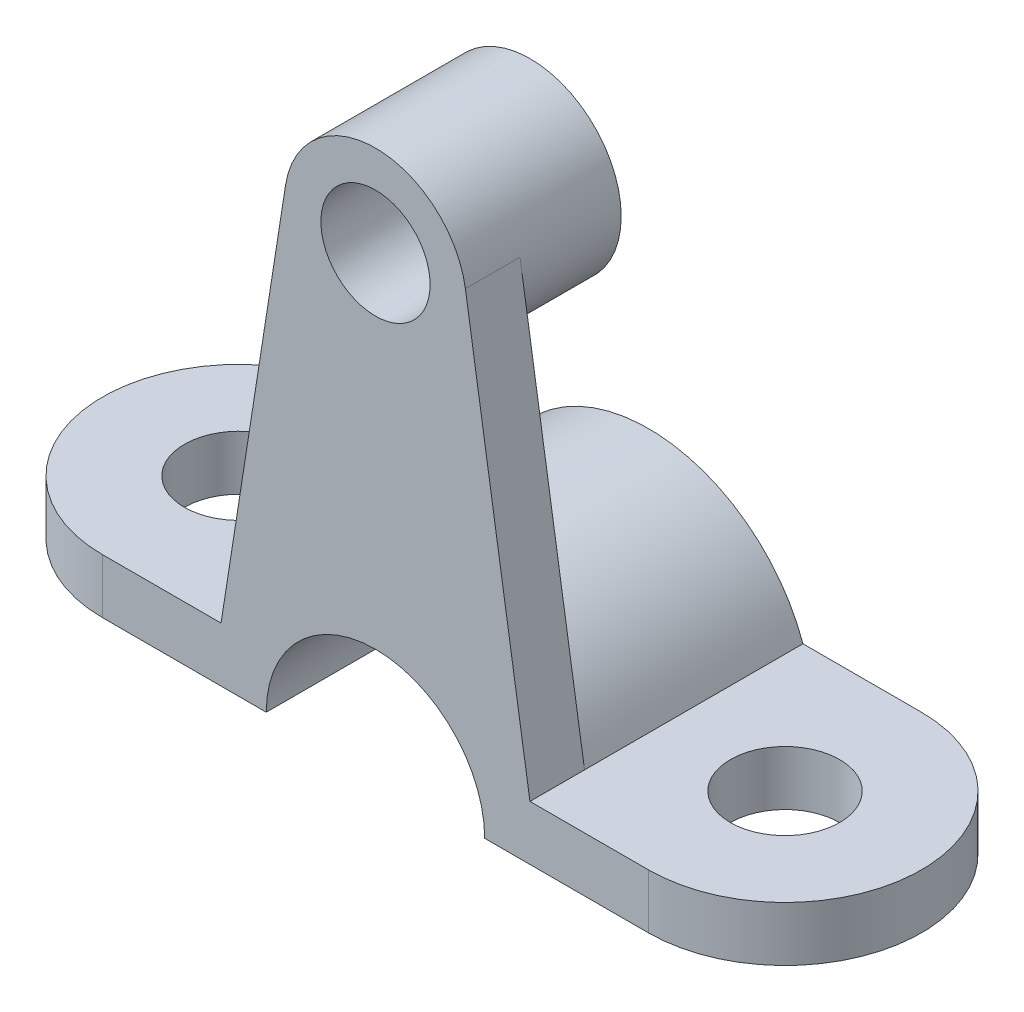
ISO-10303-21;
HEADER;
FILE_DESCRIPTION(('STEP AP214'),'2;1');
FILE_NAME('part.step','',(''),(''),'','','');
FILE_SCHEMA(('AUTOMOTIVE_DESIGN { 1 0 10303 214 1 1 1 1 }'));
ENDSEC;
DATA;
#1=APPLICATION_CONTEXT('core data for automotive mechanical design processes');
#2=APPLICATION_PROTOCOL_DEFINITION('international standard','automotive_design',2000,#1);
#3=PRODUCT_CONTEXT('',#1,'mechanical');
#4=PRODUCT('Part','Part','',(#3));
#5=PRODUCT_RELATED_PRODUCT_CATEGORY('part','',(#4));
#6=PRODUCT_DEFINITION_FORMATION('','',#4);
#7=PRODUCT_DEFINITION_CONTEXT('part definition',#1,'design');
#8=PRODUCT_DEFINITION('design','',#6,#7);
#9=PRODUCT_DEFINITION_SHAPE('','',#8);
#10=(LENGTH_UNIT() NAMED_UNIT(*) SI_UNIT(.MILLI.,.METRE.));
#11=(NAMED_UNIT(*) PLANE_ANGLE_UNIT() SI_UNIT($,.RADIAN.));
#12=(NAMED_UNIT(*) SI_UNIT($,.STERADIAN.) SOLID_ANGLE_UNIT());
#13=UNCERTAINTY_MEASURE_WITH_UNIT(LENGTH_MEASURE(1.E-05),#10,'distance_accuracy_value','');
#14=(GEOMETRIC_REPRESENTATION_CONTEXT(3) GLOBAL_UNCERTAINTY_ASSIGNED_CONTEXT((#13)) GLOBAL_UNIT_ASSIGNED_CONTEXT((#10,
#11,#12)) REPRESENTATION_CONTEXT('',''));
#15=CARTESIAN_POINT('',(0.,0.,0.));
#16=DIRECTION('',(0.,0.,1.));
#17=DIRECTION('',(1.,0.,0.));
#18=AXIS2_PLACEMENT_3D('',#15,#16,#17);
#19=CARTESIAN_POINT('',(0.,0.,30.));
#20=DIRECTION('',(0.,0.,-1.));
#21=DIRECTION('',(-1.,0.,0.));
#22=AXIS2_PLACEMENT_3D('',#19,#20,#21);
#23=CYLINDRICAL_SURFACE('',#22,36.);
#24=CARTESIAN_POINT('',(0.,0.,18.));
#25=DIRECTION('',(0.,0.,1.));
#26=DIRECTION('',(1.,0.,0.));
#27=AXIS2_PLACEMENT_3D('',#24,#25,#26);
#28=CIRCLE('',#27,36.);
#29=CARTESIAN_POINT('',(33.9411254969543,12.,18.));
#30=VERTEX_POINT('',#29);
#31=CARTESIAN_POINT('',(-33.9411254969543,12.,18.));
#32=VERTEX_POINT('',#31);
#33=EDGE_CURVE('E47',#30,#32,#28,.T.);
#34=ORIENTED_EDGE('',*,*,#33,.F.);
#35=DIRECTION('',(0.,0.,-1.));
#36=VECTOR('',#35,1.);
#37=CARTESIAN_POINT('',(33.9411254969543,12.,30.));
#38=LINE('',#37,#36);
#39=CARTESIAN_POINT('',(33.9411254969543,12.,-30.));
#40=VERTEX_POINT('',#39);
#41=EDGE_CURVE('E185',#40,#30,#38,.F.);
#42=ORIENTED_EDGE('',*,*,#41,.F.);
#43=CARTESIAN_POINT('',(0.,0.,-30.));
#44=DIRECTION('',(0.,0.,1.));
#45=DIRECTION('',(1.,0.,0.));
#46=AXIS2_PLACEMENT_3D('',#43,#44,#45);
#47=CIRCLE('',#46,36.);
#48=CARTESIAN_POINT('',(-33.9411254969543,12.,-30.));
#49=VERTEX_POINT('',#48);
#50=EDGE_CURVE('E187',#40,#49,#47,.T.);
#51=ORIENTED_EDGE('',*,*,#50,.T.);
#52=DIRECTION('',(0.,0.,-1.));
#53=VECTOR('',#52,1.);
#54=CARTESIAN_POINT('',(-33.9411254969543,12.,30.));
#55=LINE('',#54,#53);
#56=EDGE_CURVE('E167',#49,#32,#55,.F.);
#57=ORIENTED_EDGE('',*,*,#56,.T.);
#58=EDGE_LOOP('',(#34,#42,#51,#57));
#59=FACE_BOUND('',#58,.T.);
#60=ADVANCED_FACE('F33',(#59),#23,.T.);
#61=CARTESIAN_POINT('',(-36.,0.,30.));
#62=DIRECTION('',(0.,1.,0.));
#63=DIRECTION('',(0.,0.,1.));
#64=AXIS2_PLACEMENT_3D('',#61,#62,#63);
#65=PLANE('',#64);
#66=CARTESIAN_POINT('',(-60.,0.,0.));
#67=DIRECTION('',(0.,1.,0.));
#68=DIRECTION('',(0.,0.,1.));
#69=AXIS2_PLACEMENT_3D('',#66,#67,#68);
#70=CIRCLE('',#69,12.);
#71=CARTESIAN_POINT('',(-60.,0.,12.));
#72=VERTEX_POINT('',#71);
#73=EDGE_CURVE('E291',#72,#72,#70,.T.);
#74=ORIENTED_EDGE('',*,*,#73,.T.);
#75=EDGE_LOOP('',(#74));
#76=FACE_BOUND('',#75,.T.);
#77=DIRECTION('',(1.,0.,0.));
#78=VECTOR('',#77,1.);
#79=CARTESIAN_POINT('',(-36.,0.,-30.));
#80=LINE('',#79,#78);
#81=CARTESIAN_POINT('',(-60.,0.,-30.));
#82=VERTEX_POINT('',#81);
#83=CARTESIAN_POINT('',(-24.,0.,-30.));
#84=VERTEX_POINT('',#83);
#85=EDGE_CURVE('E197',#82,#84,#80,.T.);
#86=ORIENTED_EDGE('',*,*,#85,.T.);
#87=DIRECTION('',(0.,0.,-1.));
#88=VECTOR('',#87,1.);
#89=CARTESIAN_POINT('',(-24.,0.,30.));
#90=LINE('',#89,#88);
#91=CARTESIAN_POINT('',(-24.,0.,30.));
#92=VERTEX_POINT('',#91);
#93=EDGE_CURVE('E11',#92,#84,#90,.T.);
#94=ORIENTED_EDGE('',*,*,#93,.F.);
#95=DIRECTION('',(1.,0.,0.));
#96=VECTOR('',#95,1.);
#97=CARTESIAN_POINT('',(-36.,0.,30.));
#98=LINE('',#97,#96);
#99=CARTESIAN_POINT('',(-60.,0.,30.));
#100=VERTEX_POINT('',#99);
#101=EDGE_CURVE('E188',#100,#92,#98,.T.);
#102=ORIENTED_EDGE('',*,*,#101,.F.);
#103=CARTESIAN_POINT('',(-60.,0.,0.));
#104=DIRECTION('',(0.,1.,0.));
#105=DIRECTION('',(0.,0.,1.));
#106=AXIS2_PLACEMENT_3D('',#103,#104,#105);
#107=CIRCLE('',#106,30.);
#108=EDGE_CURVE('E144',#82,#100,#107,.T.);
#109=ORIENTED_EDGE('',*,*,#108,.F.);
#110=EDGE_LOOP('',(#86,#94,#102,#109));
#111=FACE_BOUND('',#110,.T.);
#112=ADVANCED_FACE('F221',(#76,#111),#65,.F.);
#113=CARTESIAN_POINT('',(0.,0.,30.));
#114=DIRECTION('',(0.,0.,-1.));
#115=DIRECTION('',(-1.,0.,0.));
#116=AXIS2_PLACEMENT_3D('',#113,#114,#115);
#117=CYLINDRICAL_SURFACE('',#116,24.);
#118=CARTESIAN_POINT('',(0.,0.,-30.));
#119=DIRECTION('',(0.,0.,-1.));
#120=DIRECTION('',(1.,0.,0.));
#121=AXIS2_PLACEMENT_3D('',#118,#119,#120);
#122=CIRCLE('',#121,24.);
#123=CARTESIAN_POINT('',(24.,0.,-30.));
#124=VERTEX_POINT('',#123);
#125=EDGE_CURVE('E199',#84,#124,#122,.T.);
#126=ORIENTED_EDGE('',*,*,#125,.T.);
#127=DIRECTION('',(0.,0.,-1.));
#128=VECTOR('',#127,1.);
#129=CARTESIAN_POINT('',(24.,0.,30.));
#130=LINE('',#129,#128);
#131=CARTESIAN_POINT('',(24.,0.,30.));
#132=VERTEX_POINT('',#131);
#133=EDGE_CURVE('E40',#132,#124,#130,.T.);
#134=ORIENTED_EDGE('',*,*,#133,.F.);
#135=CARTESIAN_POINT('',(0.,0.,30.));
#136=DIRECTION('',(0.,0.,-1.));
#137=DIRECTION('',(1.,0.,0.));
#138=AXIS2_PLACEMENT_3D('',#135,#136,#137);
#139=CIRCLE('',#138,24.);
#140=EDGE_CURVE('E190',#92,#132,#139,.T.);
#141=ORIENTED_EDGE('',*,*,#140,.F.);
#142=ORIENTED_EDGE('',*,*,#93,.T.);
#143=EDGE_LOOP('',(#126,#134,#141,#142));
#144=FACE_BOUND('',#143,.T.);
#145=ADVANCED_FACE('F219',(#144),#117,.F.);
#146=CARTESIAN_POINT('',(24.,0.,30.));
#147=DIRECTION('',(0.,1.,0.));
#148=DIRECTION('',(0.,0.,1.));
#149=AXIS2_PLACEMENT_3D('',#146,#147,#148);
#150=PLANE('',#149);
#151=CARTESIAN_POINT('',(60.,0.,0.));
#152=DIRECTION('',(0.,-1.,0.));
#153=DIRECTION('',(0.,0.,1.));
#154=AXIS2_PLACEMENT_3D('',#151,#152,#153);
#155=CIRCLE('',#154,12.);
#156=CARTESIAN_POINT('',(60.,0.,12.));
#157=VERTEX_POINT('',#156);
#158=EDGE_CURVE('E292',#157,#157,#155,.T.);
#159=ORIENTED_EDGE('',*,*,#158,.F.);
#160=EDGE_LOOP('',(#159));
#161=FACE_BOUND('',#160,.T.);
#162=CARTESIAN_POINT('',(60.,0.,0.));
#163=DIRECTION('',(0.,1.,0.));
#164=DIRECTION('',(0.,0.,-1.));
#165=AXIS2_PLACEMENT_3D('',#162,#163,#164);
#166=CIRCLE('',#165,30.);
#167=CARTESIAN_POINT('',(60.,0.,30.));
#168=VERTEX_POINT('',#167);
#169=CARTESIAN_POINT('',(60.,0.,-30.));
#170=VERTEX_POINT('',#169);
#171=EDGE_CURVE('E169',#168,#170,#166,.T.);
#172=ORIENTED_EDGE('',*,*,#171,.F.);
#173=DIRECTION('',(1.,0.,0.));
#174=VECTOR('',#173,1.);
#175=CARTESIAN_POINT('',(24.,0.,30.));
#176=LINE('',#175,#174);
#177=EDGE_CURVE('E193',#132,#168,#176,.T.);
#178=ORIENTED_EDGE('',*,*,#177,.F.);
#179=ORIENTED_EDGE('',*,*,#133,.T.);
#180=DIRECTION('',(1.,0.,0.));
#181=VECTOR('',#180,1.);
#182=CARTESIAN_POINT('',(24.,0.,-30.));
#183=LINE('',#182,#181);
#184=EDGE_CURVE('E191',#124,#170,#183,.T.);
#185=ORIENTED_EDGE('',*,*,#184,.T.);
#186=EDGE_LOOP('',(#172,#178,#179,#185));
#187=FACE_BOUND('',#186,.T.);
#188=ADVANCED_FACE('F207',(#161,#187),#150,.F.);
#189=CARTESIAN_POINT('',(0.,0.,30.));
#190=DIRECTION('',(0.,0.,1.));
#191=DIRECTION('',(1.,0.,0.));
#192=AXIS2_PLACEMENT_3D('',#189,#190,#191);
#193=PLANE('',#192);
#194=ORIENTED_EDGE('',*,*,#101,.T.);
#195=ORIENTED_EDGE('',*,*,#140,.T.);
#196=ORIENTED_EDGE('',*,*,#177,.T.);
#197=DIRECTION('',(0.,-1.,0.));
#198=VECTOR('',#197,1.);
#199=CARTESIAN_POINT('',(60.,12.,30.));
#200=LINE('',#199,#198);
#201=CARTESIAN_POINT('',(60.,12.,30.));
#202=VERTEX_POINT('',#201);
#203=EDGE_CURVE('E182',#202,#168,#200,.T.);
#204=ORIENTED_EDGE('',*,*,#203,.F.);
#205=DIRECTION('',(1.,0.,0.));
#206=VECTOR('',#205,1.);
#207=CARTESIAN_POINT('',(36.,12.,30.));
#208=LINE('',#207,#206);
#209=CARTESIAN_POINT('',(33.9411254969543,12.,30.));
#210=VERTEX_POINT('',#209);
#211=EDGE_CURVE('E134',#210,#202,#208,.T.);
#212=ORIENTED_EDGE('',*,*,#211,.F.);
#213=DIRECTION('',(0.154843634282394,-0.98793899048586,0.));
#214=VECTOR('',#213,1.);
#215=CARTESIAN_POINT('',(34.9630471326725,5.47989839023076,30.));
#216=LINE('',#215,#214);
#217=CARTESIAN_POINT('',(19.7587798097172,102.486718074684,30.));
#218=VERTEX_POINT('',#217);
#219=EDGE_CURVE('E130',#218,#210,#216,.T.);
#220=ORIENTED_EDGE('',*,*,#219,.F.);
#221=CARTESIAN_POINT('',(0.,99.389845389036,30.));
#222=DIRECTION('',(0.,0.,1.));
#223=DIRECTION('',(1.,0.,0.));
#224=AXIS2_PLACEMENT_3D('',#221,#222,#223);
#225=CIRCLE('',#224,20.);
#226=CARTESIAN_POINT('',(-19.7587798097172,102.486718074684,30.));
#227=VERTEX_POINT('',#226);
#228=EDGE_CURVE('E114',#218,#227,#225,.T.);
#229=ORIENTED_EDGE('',*,*,#228,.T.);
#230=DIRECTION('',(-0.154843634282394,-0.98793899048586,0.));
#231=VECTOR('',#230,1.);
#232=CARTESIAN_POINT('',(-34.9630471326725,5.47989839023076,30.));
#233=LINE('',#232,#231);
#234=CARTESIAN_POINT('',(-33.9411254969543,12.,30.));
#235=VERTEX_POINT('',#234);
#236=EDGE_CURVE('E138',#227,#235,#233,.T.);
#237=ORIENTED_EDGE('',*,*,#236,.T.);
#238=DIRECTION('',(1.,0.,0.));
#239=VECTOR('',#238,1.);
#240=CARTESIAN_POINT('',(-60.,12.,30.));
#241=LINE('',#240,#239);
#242=CARTESIAN_POINT('',(-60.,12.,30.));
#243=VERTEX_POINT('',#242);
#244=EDGE_CURVE('E157',#243,#235,#241,.T.);
#245=ORIENTED_EDGE('',*,*,#244,.F.);
#246=DIRECTION('',(0.,-1.,0.));
#247=VECTOR('',#246,1.);
#248=CARTESIAN_POINT('',(-60.,12.,30.));
#249=LINE('',#248,#247);
#250=EDGE_CURVE('E164',#243,#100,#249,.T.);
#251=ORIENTED_EDGE('',*,*,#250,.T.);
#252=EDGE_LOOP('',(#194,#195,#196,#204,#212,#220,#229,#237,#245,#251));
#253=FACE_BOUND('',#252,.T.);
#254=CARTESIAN_POINT('',(0.,99.389845389036,30.));
#255=DIRECTION('',(0.,0.,1.));
#256=DIRECTION('',(1.,0.,0.));
#257=AXIS2_PLACEMENT_3D('',#254,#255,#256);
#258=CIRCLE('',#257,12.);
#259=CARTESIAN_POINT('',(12.,99.389845389036,30.));
#260=VERTEX_POINT('',#259);
#261=EDGE_CURVE('E245',#260,#260,#258,.T.);
#262=ORIENTED_EDGE('',*,*,#261,.F.);
#263=EDGE_LOOP('',(#262));
#264=FACE_BOUND('',#263,.T.);
#265=ADVANCED_FACE('F131',(#253,#264),#193,.T.);
#266=CARTESIAN_POINT('',(0.,0.,-30.));
#267=DIRECTION('',(0.,0.,1.));
#268=DIRECTION('',(1.,0.,0.));
#269=AXIS2_PLACEMENT_3D('',#266,#267,#268);
#270=PLANE('',#269);
#271=ORIENTED_EDGE('',*,*,#125,.F.);
#272=ORIENTED_EDGE('',*,*,#85,.F.);
#273=DIRECTION('',(0.,-1.,0.));
#274=VECTOR('',#273,1.);
#275=CARTESIAN_POINT('',(-60.,12.,-30.));
#276=LINE('',#275,#274);
#277=CARTESIAN_POINT('',(-60.,12.,-30.));
#278=VERTEX_POINT('',#277);
#279=EDGE_CURVE('E160',#278,#82,#276,.T.);
#280=ORIENTED_EDGE('',*,*,#279,.F.);
#281=DIRECTION('',(-1.,0.,0.));
#282=VECTOR('',#281,1.);
#283=CARTESIAN_POINT('',(-30.,12.,-30.));
#284=LINE('',#283,#282);
#285=EDGE_CURVE('E159',#49,#278,#284,.T.);
#286=ORIENTED_EDGE('',*,*,#285,.F.);
#287=ORIENTED_EDGE('',*,*,#50,.F.);
#288=DIRECTION('',(-1.,0.,0.));
#289=VECTOR('',#288,1.);
#290=CARTESIAN_POINT('',(30.,12.,-30.));
#291=LINE('',#290,#289);
#292=CARTESIAN_POINT('',(60.,12.,-30.));
#293=VERTEX_POINT('',#292);
#294=EDGE_CURVE('E170',#293,#40,#291,.T.);
#295=ORIENTED_EDGE('',*,*,#294,.F.);
#296=DIRECTION('',(0.,-1.,0.));
#297=VECTOR('',#296,1.);
#298=CARTESIAN_POINT('',(60.,12.,-30.));
#299=LINE('',#298,#297);
#300=EDGE_CURVE('E177',#293,#170,#299,.T.);
#301=ORIENTED_EDGE('',*,*,#300,.T.);
#302=ORIENTED_EDGE('',*,*,#184,.F.);
#303=EDGE_LOOP('',(#271,#272,#280,#286,#287,#295,#301,#302));
#304=FACE_BOUND('',#303,.T.);
#305=ADVANCED_FACE('F212',(#304),#270,.F.);
#306=CARTESIAN_POINT('',(60.,12.,0.));
#307=DIRECTION('',(0.,-1.,0.));
#308=DIRECTION('',(0.,0.,-1.));
#309=AXIS2_PLACEMENT_3D('',#306,#307,#308);
#310=PLANE('',#309);
#311=CARTESIAN_POINT('',(60.,12.,0.));
#312=DIRECTION('',(0.,-1.,0.));
#313=DIRECTION('',(0.,0.,1.));
#314=AXIS2_PLACEMENT_3D('',#311,#312,#313);
#315=CIRCLE('',#314,12.);
#316=CARTESIAN_POINT('',(60.,12.,12.));
#317=VERTEX_POINT('',#316);
#318=EDGE_CURVE('E296',#317,#317,#315,.T.);
#319=ORIENTED_EDGE('',*,*,#318,.T.);
#320=EDGE_LOOP('',(#319));
#321=FACE_BOUND('',#320,.T.);
#322=ORIENTED_EDGE('',*,*,#294,.T.);
#323=ORIENTED_EDGE('',*,*,#41,.T.);
#324=DIRECTION('',(0.,0.,1.));
#325=VECTOR('',#324,1.);
#326=CARTESIAN_POINT('',(33.9411254969543,12.,18.));
#327=LINE('',#326,#325);
#328=EDGE_CURVE('E145',#30,#210,#327,.T.);
#329=ORIENTED_EDGE('',*,*,#328,.T.);
#330=ORIENTED_EDGE('',*,*,#211,.T.);
#331=CARTESIAN_POINT('',(60.,12.,0.));
#332=DIRECTION('',(0.,1.,0.));
#333=DIRECTION('',(0.,0.,-1.));
#334=AXIS2_PLACEMENT_3D('',#331,#332,#333);
#335=CIRCLE('',#334,30.);
#336=EDGE_CURVE('E174',#202,#293,#335,.T.);
#337=ORIENTED_EDGE('',*,*,#336,.T.);
#338=EDGE_LOOP('',(#322,#323,#329,#330,#337));
#339=FACE_BOUND('',#338,.T.);
#340=ADVANCED_FACE('F231',(#321,#339),#310,.F.);
#341=CARTESIAN_POINT('',(60.,12.,0.));
#342=DIRECTION('',(0.,-1.,0.));
#343=DIRECTION('',(0.,0.,-1.));
#344=AXIS2_PLACEMENT_3D('',#341,#342,#343);
#345=CYLINDRICAL_SURFACE('',#344,30.);
#346=ORIENTED_EDGE('',*,*,#171,.T.);
#347=ORIENTED_EDGE('',*,*,#300,.F.);
#348=ORIENTED_EDGE('',*,*,#336,.F.);
#349=ORIENTED_EDGE('',*,*,#203,.T.);
#350=EDGE_LOOP('',(#346,#347,#348,#349));
#351=FACE_BOUND('',#350,.T.);
#352=ADVANCED_FACE('F217',(#351),#345,.T.);
#353=CARTESIAN_POINT('',(-60.,12.,0.));
#354=DIRECTION('',(0.,1.,0.));
#355=DIRECTION('',(0.,0.,1.));
#356=AXIS2_PLACEMENT_3D('',#353,#354,#355);
#357=PLANE('',#356);
#358=CARTESIAN_POINT('',(-60.,12.,0.));
#359=DIRECTION('',(0.,1.,0.));
#360=DIRECTION('',(0.,0.,1.));
#361=AXIS2_PLACEMENT_3D('',#358,#359,#360);
#362=CIRCLE('',#361,12.);
#363=CARTESIAN_POINT('',(-60.,12.,12.));
#364=VERTEX_POINT('',#363);
#365=EDGE_CURVE('E289',#364,#364,#362,.T.);
#366=ORIENTED_EDGE('',*,*,#365,.F.);
#367=EDGE_LOOP('',(#366));
#368=FACE_BOUND('',#367,.T.);
#369=ORIENTED_EDGE('',*,*,#56,.F.);
#370=ORIENTED_EDGE('',*,*,#285,.T.);
#371=CARTESIAN_POINT('',(-60.,12.,0.));
#372=DIRECTION('',(0.,1.,0.));
#373=DIRECTION('',(0.,0.,1.));
#374=AXIS2_PLACEMENT_3D('',#371,#372,#373);
#375=CIRCLE('',#374,30.);
#376=EDGE_CURVE('E148',#278,#243,#375,.T.);
#377=ORIENTED_EDGE('',*,*,#376,.T.);
#378=ORIENTED_EDGE('',*,*,#244,.T.);
#379=DIRECTION('',(0.,0.,1.));
#380=VECTOR('',#379,1.);
#381=CARTESIAN_POINT('',(-33.9411254969543,12.,18.));
#382=LINE('',#381,#380);
#383=EDGE_CURVE('E55',#32,#235,#382,.T.);
#384=ORIENTED_EDGE('',*,*,#383,.F.);
#385=EDGE_LOOP('',(#369,#370,#377,#378,#384));
#386=FACE_BOUND('',#385,.T.);
#387=ADVANCED_FACE('F229',(#368,#386),#357,.T.);
#388=CARTESIAN_POINT('',(-60.,12.,0.));
#389=DIRECTION('',(0.,-1.,0.));
#390=DIRECTION('',(0.,0.,-1.));
#391=AXIS2_PLACEMENT_3D('',#388,#389,#390);
#392=CYLINDRICAL_SURFACE('',#391,30.);
#393=ORIENTED_EDGE('',*,*,#108,.T.);
#394=ORIENTED_EDGE('',*,*,#250,.F.);
#395=ORIENTED_EDGE('',*,*,#376,.F.);
#396=ORIENTED_EDGE('',*,*,#279,.T.);
#397=EDGE_LOOP('',(#393,#394,#395,#396));
#398=FACE_BOUND('',#397,.T.);
#399=ADVANCED_FACE('F227',(#398),#392,.T.);
#400=CARTESIAN_POINT('',(34.9630471326725,5.47989839023076,18.));
#401=DIRECTION('',(-0.98793899048586,-0.154843634282394,0.));
#402=DIRECTION('',(0.154843634282395,-0.98793899048586,0.));
#403=AXIS2_PLACEMENT_3D('',#400,#401,#402);
#404=PLANE('',#403);
#405=ORIENTED_EDGE('',*,*,#219,.T.);
#406=ORIENTED_EDGE('',*,*,#328,.F.);
#407=DIRECTION('',(0.154843634282394,-0.98793899048586,0.));
#408=VECTOR('',#407,1.);
#409=CARTESIAN_POINT('',(34.9630471326725,5.47989839023076,18.));
#410=LINE('',#409,#408);
#411=CARTESIAN_POINT('',(19.7587798097172,102.486718074684,18.));
#412=VERTEX_POINT('',#411);
#413=EDGE_CURVE('E142',#412,#30,#410,.T.);
#414=ORIENTED_EDGE('',*,*,#413,.F.);
#415=DIRECTION('',(0.,0.,1.));
#416=VECTOR('',#415,1.);
#417=CARTESIAN_POINT('',(19.7587798097172,102.486718074684,18.));
#418=LINE('',#417,#416);
#419=EDGE_CURVE('E118',#412,#218,#418,.T.);
#420=ORIENTED_EDGE('',*,*,#419,.T.);
#421=EDGE_LOOP('',(#405,#406,#414,#420));
#422=FACE_BOUND('',#421,.T.);
#423=ADVANCED_FACE('F140',(#422),#404,.F.);
#424=CARTESIAN_POINT('',(-34.9630471326725,5.47989839023076,18.));
#425=DIRECTION('',(-0.98793899048586,0.154843634282394,0.));
#426=DIRECTION('',(-0.154843634282395,-0.98793899048586,0.));
#427=AXIS2_PLACEMENT_3D('',#424,#425,#426);
#428=PLANE('',#427);
#429=ORIENTED_EDGE('',*,*,#236,.F.);
#430=DIRECTION('',(0.,0.,1.));
#431=VECTOR('',#430,1.);
#432=CARTESIAN_POINT('',(-19.7587798097172,102.486718074684,18.));
#433=LINE('',#432,#431);
#434=CARTESIAN_POINT('',(-19.7587798097172,102.486718074684,18.));
#435=VERTEX_POINT('',#434);
#436=EDGE_CURVE('E121',#435,#227,#433,.T.);
#437=ORIENTED_EDGE('',*,*,#436,.F.);
#438=DIRECTION('',(-0.154843634282394,-0.98793899048586,0.));
#439=VECTOR('',#438,1.);
#440=CARTESIAN_POINT('',(-34.9630471326725,5.47989839023076,18.));
#441=LINE('',#440,#439);
#442=EDGE_CURVE('E237',#435,#32,#441,.T.);
#443=ORIENTED_EDGE('',*,*,#442,.T.);
#444=ORIENTED_EDGE('',*,*,#383,.T.);
#445=EDGE_LOOP('',(#429,#437,#443,#444));
#446=FACE_BOUND('',#445,.T.);
#447=ADVANCED_FACE('F249',(#446),#428,.T.);
#448=CARTESIAN_POINT('',(0.,0.,18.));
#449=DIRECTION('',(0.,0.,1.));
#450=DIRECTION('',(1.,0.,0.));
#451=AXIS2_PLACEMENT_3D('',#448,#449,#450);
#452=PLANE('',#451);
#453=CARTESIAN_POINT('',(0.,99.389845389036,18.));
#454=DIRECTION('',(0.,0.,1.));
#455=DIRECTION('',(1.,0.,0.));
#456=AXIS2_PLACEMENT_3D('',#453,#454,#455);
#457=CIRCLE('',#456,20.);
#458=EDGE_CURVE('E137',#435,#412,#457,.T.);
#459=ORIENTED_EDGE('',*,*,#458,.T.);
#460=ORIENTED_EDGE('',*,*,#413,.T.);
#461=ORIENTED_EDGE('',*,*,#33,.T.);
#462=ORIENTED_EDGE('',*,*,#442,.F.);
#463=EDGE_LOOP('',(#459,#460,#461,#462));
#464=FACE_BOUND('',#463,.T.);
#465=ADVANCED_FACE('F233',(#464),#452,.F.);
#466=CARTESIAN_POINT('',(0.,99.389845389036,-4.));
#467=DIRECTION('',(0.,0.,1.));
#468=DIRECTION('',(1.,0.,0.));
#469=AXIS2_PLACEMENT_3D('',#466,#467,#468);
#470=CYLINDRICAL_SURFACE('',#469,20.);
#471=CARTESIAN_POINT('',(0.,99.389845389036,-4.));
#472=DIRECTION('',(0.,0.,1.));
#473=DIRECTION('',(1.,0.,0.));
#474=AXIS2_PLACEMENT_3D('',#471,#472,#473);
#475=CIRCLE('',#474,20.);
#476=CARTESIAN_POINT('',(20.,99.389845389036,-4.));
#477=VERTEX_POINT('',#476);
#478=EDGE_CURVE('E125',#477,#477,#475,.T.);
#479=ORIENTED_EDGE('',*,*,#478,.T.);
#480=EDGE_LOOP('',(#479));
#481=FACE_BOUND('',#480,.T.);
#482=ORIENTED_EDGE('',*,*,#419,.F.);
#483=ORIENTED_EDGE('',*,*,#458,.F.);
#484=ORIENTED_EDGE('',*,*,#436,.T.);
#485=ORIENTED_EDGE('',*,*,#228,.F.);
#486=EDGE_LOOP('',(#482,#483,#484,#485));
#487=FACE_BOUND('',#486,.T.);
#488=ADVANCED_FACE('F116',(#481,#487),#470,.T.);
#489=CARTESIAN_POINT('',(0.,99.389845389036,-4.));
#490=DIRECTION('',(0.,0.,1.));
#491=DIRECTION('',(1.,0.,0.));
#492=AXIS2_PLACEMENT_3D('',#489,#490,#491);
#493=PLANE('',#492);
#494=CARTESIAN_POINT('',(0.,99.389845389036,-4.));
#495=DIRECTION('',(0.,0.,1.));
#496=DIRECTION('',(1.,0.,0.));
#497=AXIS2_PLACEMENT_3D('',#494,#495,#496);
#498=CIRCLE('',#497,12.);
#499=CARTESIAN_POINT('',(12.,99.389845389036,-4.));
#500=VERTEX_POINT('',#499);
#501=EDGE_CURVE('E126',#500,#500,#498,.T.);
#502=ORIENTED_EDGE('',*,*,#501,.T.);
#503=EDGE_LOOP('',(#502));
#504=FACE_BOUND('',#503,.T.);
#505=ORIENTED_EDGE('',*,*,#478,.F.);
#506=EDGE_LOOP('',(#505));
#507=FACE_BOUND('',#506,.T.);
#508=ADVANCED_FACE('F308',(#504,#507),#493,.F.);
#509=CARTESIAN_POINT('',(0.,99.389845389036,-4.));
#510=DIRECTION('',(0.,0.,1.));
#511=DIRECTION('',(1.,0.,0.));
#512=AXIS2_PLACEMENT_3D('',#509,#510,#511);
#513=CYLINDRICAL_SURFACE('',#512,12.);
#514=ORIENTED_EDGE('',*,*,#501,.F.);
#515=EDGE_LOOP('',(#514));
#516=FACE_BOUND('',#515,.T.);
#517=ORIENTED_EDGE('',*,*,#261,.T.);
#518=EDGE_LOOP('',(#517));
#519=FACE_BOUND('',#518,.T.);
#520=ADVANCED_FACE('F305',(#516,#519),#513,.F.);
#521=CARTESIAN_POINT('',(-60.,0.,0.));
#522=DIRECTION('',(0.,1.,0.));
#523=DIRECTION('',(0.,0.,1.));
#524=AXIS2_PLACEMENT_3D('',#521,#522,#523);
#525=CYLINDRICAL_SURFACE('',#524,12.);
#526=ORIENTED_EDGE('',*,*,#73,.F.);
#527=EDGE_LOOP('',(#526));
#528=FACE_BOUND('',#527,.T.);
#529=ORIENTED_EDGE('',*,*,#365,.T.);
#530=EDGE_LOOP('',(#529));
#531=FACE_BOUND('',#530,.T.);
#532=ADVANCED_FACE('F307',(#528,#531),#525,.F.);
#533=CARTESIAN_POINT('',(60.,0.,0.));
#534=DIRECTION('',(0.,1.,0.));
#535=DIRECTION('',(0.,0.,1.));
#536=AXIS2_PLACEMENT_3D('',#533,#534,#535);
#537=CYLINDRICAL_SURFACE('',#536,12.);
#538=ORIENTED_EDGE('',*,*,#158,.T.);
#539=EDGE_LOOP('',(#538));
#540=FACE_BOUND('',#539,.T.);
#541=ORIENTED_EDGE('',*,*,#318,.F.);
#542=EDGE_LOOP('',(#541));
#543=FACE_BOUND('',#542,.T.);
#544=ADVANCED_FACE('F315',(#540,#543),#537,.F.);
#545=CLOSED_SHELL('',(#60,#112,#145,#188,#265,#305,#340,#352,#387,#399,#423,#447,#465,#488,#508,
#520,#532,#544));
#546=MANIFOLD_SOLID_BREP('B2',#545);
#547=ADVANCED_BREP_SHAPE_REPRESENTATION('',(#18,#546),#14);
#548=SHAPE_DEFINITION_REPRESENTATION(#9,#547);
ENDSEC;
END-ISO-10303-21;
